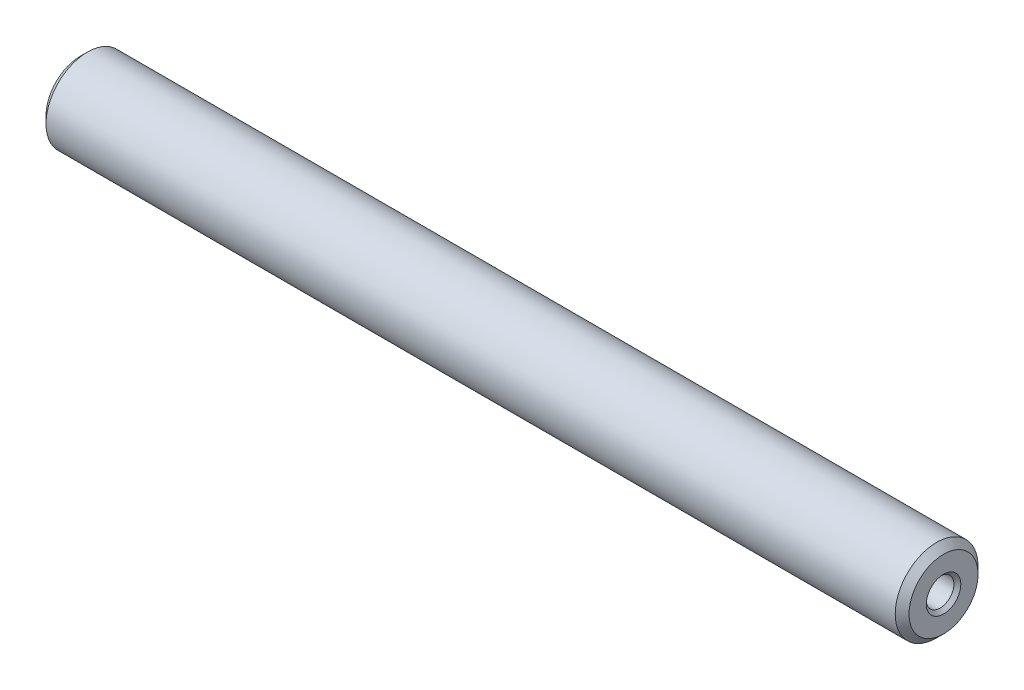
ISO-10303-21;
HEADER;
FILE_DESCRIPTION(('STEP AP214'),'2;1');
FILE_NAME('part.step','',(''),(''),'','','');
FILE_SCHEMA(('AUTOMOTIVE_DESIGN { 1 0 10303 214 1 1 1 1 }'));
ENDSEC;
DATA;
#1=APPLICATION_CONTEXT('core data for automotive mechanical design processes');
#2=APPLICATION_PROTOCOL_DEFINITION('international standard','automotive_design',2000,#1);
#3=PRODUCT_CONTEXT('',#1,'mechanical');
#4=PRODUCT('Part','Part','',(#3));
#5=PRODUCT_RELATED_PRODUCT_CATEGORY('part','',(#4));
#6=PRODUCT_DEFINITION_FORMATION('','',#4);
#7=PRODUCT_DEFINITION_CONTEXT('part definition',#1,'design');
#8=PRODUCT_DEFINITION('design','',#6,#7);
#9=PRODUCT_DEFINITION_SHAPE('','',#8);
#10=(LENGTH_UNIT() NAMED_UNIT(*) SI_UNIT(.MILLI.,.METRE.));
#11=(NAMED_UNIT(*) PLANE_ANGLE_UNIT() SI_UNIT($,.RADIAN.));
#12=(NAMED_UNIT(*) SI_UNIT($,.STERADIAN.) SOLID_ANGLE_UNIT());
#13=UNCERTAINTY_MEASURE_WITH_UNIT(LENGTH_MEASURE(1.E-05),#10,'distance_accuracy_value','');
#14=(GEOMETRIC_REPRESENTATION_CONTEXT(3) GLOBAL_UNCERTAINTY_ASSIGNED_CONTEXT((#13)) GLOBAL_UNIT_ASSIGNED_CONTEXT((#10,
#11,#12)) REPRESENTATION_CONTEXT('',''));
#15=CARTESIAN_POINT('',(0.,0.,0.));
#16=DIRECTION('',(0.,0.,1.));
#17=DIRECTION('',(1.,0.,0.));
#18=AXIS2_PLACEMENT_3D('',#15,#16,#17);
#19=CARTESIAN_POINT('',(-62.5,0.,0.));
#20=DIRECTION('',(1.,0.,0.));
#21=DIRECTION('',(0.,0.,-1.));
#22=AXIS2_PLACEMENT_3D('',#19,#20,#21);
#23=PLANE('',#22);
#24=CARTESIAN_POINT('',(-62.5,0.,0.));
#25=DIRECTION('',(-1.,0.,0.));
#26=DIRECTION('',(0.,0.,1.));
#27=AXIS2_PLACEMENT_3D('',#24,#25,#26);
#28=CIRCLE('',#27,2.5);
#29=CARTESIAN_POINT('',(-62.5,0.,2.5));
#30=VERTEX_POINT('',#29);
#31=EDGE_CURVE('E53',#30,#30,#28,.T.);
#32=ORIENTED_EDGE('',*,*,#31,.F.);
#33=EDGE_LOOP('',(#32));
#34=FACE_BOUND('',#33,.T.);
#35=CARTESIAN_POINT('',(-62.5,0.,0.));
#36=DIRECTION('',(1.,0.,0.));
#37=DIRECTION('',(0.,0.,-1.));
#38=AXIS2_PLACEMENT_3D('',#35,#36,#37);
#39=CIRCLE('',#38,4.99999999999999);
#40=CARTESIAN_POINT('',(-62.5,0.,-4.99999999999999));
#41=VERTEX_POINT('',#40);
#42=EDGE_CURVE('E11',#41,#41,#39,.F.);
#43=ORIENTED_EDGE('',*,*,#42,.T.);
#44=EDGE_LOOP('',(#43));
#45=FACE_BOUND('',#44,.T.);
#46=ADVANCED_FACE('F30',(#34,#45),#23,.F.);
#47=CARTESIAN_POINT('',(-35.6829716193656,0.,0.));
#48=DIRECTION('',(-1.,0.,0.));
#49=DIRECTION('',(0.,0.,1.));
#50=AXIS2_PLACEMENT_3D('',#47,#48,#49);
#51=CYLINDRICAL_SURFACE('',#50,6.);
#52=CARTESIAN_POINT('',(61.5,0.,0.));
#53=DIRECTION('',(-1.,0.,0.));
#54=DIRECTION('',(0.,0.,1.));
#55=AXIS2_PLACEMENT_3D('',#52,#53,#54);
#56=CIRCLE('',#55,6.);
#57=CARTESIAN_POINT('',(61.5,0.,6.));
#58=VERTEX_POINT('',#57);
#59=EDGE_CURVE('E72',#58,#58,#56,.T.);
#60=ORIENTED_EDGE('',*,*,#59,.T.);
#61=EDGE_LOOP('',(#60));
#62=FACE_BOUND('',#61,.T.);
#63=CARTESIAN_POINT('',(-61.5,0.,0.));
#64=DIRECTION('',(1.,0.,0.));
#65=DIRECTION('',(0.,0.,-1.));
#66=AXIS2_PLACEMENT_3D('',#63,#64,#65);
#67=CIRCLE('',#66,6.);
#68=CARTESIAN_POINT('',(-61.5,0.,-6.));
#69=VERTEX_POINT('',#68);
#70=EDGE_CURVE('E69',#69,#69,#67,.T.);
#71=ORIENTED_EDGE('',*,*,#70,.T.);
#72=EDGE_LOOP('',(#71));
#73=FACE_BOUND('',#72,.T.);
#74=ADVANCED_FACE('F86',(#62,#73),#51,.T.);
#75=CARTESIAN_POINT('',(62.5,6.,0.));
#76=DIRECTION('',(-1.,0.,0.));
#77=DIRECTION('',(0.,0.,1.));
#78=AXIS2_PLACEMENT_3D('',#75,#76,#77);
#79=PLANE('',#78);
#80=CARTESIAN_POINT('',(62.5,0.,0.));
#81=DIRECTION('',(1.,0.,0.));
#82=DIRECTION('',(0.,0.,-1.));
#83=AXIS2_PLACEMENT_3D('',#80,#81,#82);
#84=CIRCLE('',#83,2.5);
#85=CARTESIAN_POINT('',(62.5,0.,-2.5));
#86=VERTEX_POINT('',#85);
#87=EDGE_CURVE('E60',#86,#86,#84,.T.);
#88=ORIENTED_EDGE('',*,*,#87,.F.);
#89=EDGE_LOOP('',(#88));
#90=FACE_BOUND('',#89,.T.);
#91=CARTESIAN_POINT('',(62.5,0.,0.));
#92=DIRECTION('',(-1.,0.,0.));
#93=DIRECTION('',(0.,0.,1.));
#94=AXIS2_PLACEMENT_3D('',#91,#92,#93);
#95=CIRCLE('',#94,5.00000000000003);
#96=CARTESIAN_POINT('',(62.5,0.,5.00000000000003));
#97=VERTEX_POINT('',#96);
#98=EDGE_CURVE('E37',#97,#97,#95,.F.);
#99=ORIENTED_EDGE('',*,*,#98,.T.);
#100=EDGE_LOOP('',(#99));
#101=FACE_BOUND('',#100,.T.);
#102=ADVANCED_FACE('F77',(#90,#101),#79,.F.);
#103=CARTESIAN_POINT('',(61.5,0.,0.));
#104=DIRECTION('',(-1.,0.,0.));
#105=DIRECTION('',(0.,0.,1.));
#106=AXIS2_PLACEMENT_3D('',#103,#104,#105);
#107=CONICAL_SURFACE('',#106,6.,0.785398163397453);
#108=ORIENTED_EDGE('',*,*,#98,.F.);
#109=EDGE_LOOP('',(#108));
#110=FACE_BOUND('',#109,.T.);
#111=ORIENTED_EDGE('',*,*,#59,.F.);
#112=EDGE_LOOP('',(#111));
#113=FACE_BOUND('',#112,.T.);
#114=ADVANCED_FACE('F79',(#110,#113),#107,.T.);
#115=CARTESIAN_POINT('',(-62.5,0.,0.));
#116=DIRECTION('',(1.,0.,0.));
#117=DIRECTION('',(0.,0.,-1.));
#118=AXIS2_PLACEMENT_3D('',#115,#116,#117);
#119=CONICAL_SURFACE('',#118,4.99999999999999,0.785398163397453);
#120=ORIENTED_EDGE('',*,*,#70,.F.);
#121=EDGE_LOOP('',(#120));
#122=FACE_BOUND('',#121,.T.);
#123=ORIENTED_EDGE('',*,*,#42,.F.);
#124=EDGE_LOOP('',(#123));
#125=FACE_BOUND('',#124,.T.);
#126=ADVANCED_FACE('F82',(#122,#125),#119,.T.);
#127=CARTESIAN_POINT('',(-51.5,0.,0.));
#128=DIRECTION('',(-1.,0.,0.));
#129=DIRECTION('',(0.,0.,1.));
#130=AXIS2_PLACEMENT_3D('',#127,#128,#129);
#131=CONICAL_SURFACE('',#130,1.99999999999999,1.02974425867665);
#132=CARTESIAN_POINT('',(-50.2982787619449,0.,0.));
#133=VERTEX_POINT('',#132);
#134=VERTEX_LOOP('',#133);
#135=FACE_BOUND('',#134,.T.);
#136=CARTESIAN_POINT('',(-51.5,0.,0.));
#137=DIRECTION('',(-1.,0.,0.));
#138=DIRECTION('',(0.,0.,1.));
#139=AXIS2_PLACEMENT_3D('',#136,#137,#138);
#140=CIRCLE('',#139,1.99999999999999);
#141=CARTESIAN_POINT('',(-51.5,0.,1.99999999999999));
#142=VERTEX_POINT('',#141);
#143=EDGE_CURVE('E66',#142,#142,#140,.T.);
#144=ORIENTED_EDGE('',*,*,#143,.T.);
#145=EDGE_LOOP('',(#144));
#146=FACE_BOUND('',#145,.T.);
#147=ADVANCED_FACE('F93',(#135,#146),#131,.F.);
#148=CARTESIAN_POINT('',(-62.5,0.,0.));
#149=DIRECTION('',(-1.,0.,0.));
#150=DIRECTION('',(0.,0.,1.));
#151=AXIS2_PLACEMENT_3D('',#148,#149,#150);
#152=CYLINDRICAL_SURFACE('',#151,1.99999999999999);
#153=ORIENTED_EDGE('',*,*,#143,.F.);
#154=EDGE_LOOP('',(#153));
#155=FACE_BOUND('',#154,.T.);
#156=CARTESIAN_POINT('',(-62.,0.,0.));
#157=DIRECTION('',(-1.,0.,0.));
#158=DIRECTION('',(0.,0.,1.));
#159=AXIS2_PLACEMENT_3D('',#156,#157,#158);
#160=CIRCLE('',#159,2.);
#161=CARTESIAN_POINT('',(-62.,0.,2.));
#162=VERTEX_POINT('',#161);
#163=EDGE_CURVE('E57',#162,#162,#160,.T.);
#164=ORIENTED_EDGE('',*,*,#163,.T.);
#165=EDGE_LOOP('',(#164));
#166=FACE_BOUND('',#165,.T.);
#167=ADVANCED_FACE('F104',(#155,#166),#152,.F.);
#168=CARTESIAN_POINT('',(-62.5,0.,0.));
#169=DIRECTION('',(-1.,0.,0.));
#170=DIRECTION('',(0.,0.,1.));
#171=AXIS2_PLACEMENT_3D('',#168,#169,#170);
#172=CONICAL_SURFACE('',#171,2.5,0.785398163397449);
#173=ORIENTED_EDGE('',*,*,#163,.F.);
#174=EDGE_LOOP('',(#173));
#175=FACE_BOUND('',#174,.T.);
#176=ORIENTED_EDGE('',*,*,#31,.T.);
#177=EDGE_LOOP('',(#176));
#178=FACE_BOUND('',#177,.T.);
#179=ADVANCED_FACE('F47',(#175,#178),#172,.F.);
#180=CARTESIAN_POINT('',(51.5,0.,0.));
#181=DIRECTION('',(1.,0.,0.));
#182=DIRECTION('',(0.,0.,-1.));
#183=AXIS2_PLACEMENT_3D('',#180,#181,#182);
#184=CONICAL_SURFACE('',#183,1.99999999999999,1.02974425867665);
#185=CARTESIAN_POINT('',(50.2982787619449,0.,0.));
#186=VERTEX_POINT('',#185);
#187=VERTEX_LOOP('',#186);
#188=FACE_BOUND('',#187,.T.);
#189=CARTESIAN_POINT('',(51.5,0.,0.));
#190=DIRECTION('',(1.,0.,0.));
#191=DIRECTION('',(0.,0.,-1.));
#192=AXIS2_PLACEMENT_3D('',#189,#190,#191);
#193=CIRCLE('',#192,1.99999999999999);
#194=CARTESIAN_POINT('',(51.5,0.,-1.99999999999999));
#195=VERTEX_POINT('',#194);
#196=EDGE_CURVE('E51',#195,#195,#193,.T.);
#197=ORIENTED_EDGE('',*,*,#196,.T.);
#198=EDGE_LOOP('',(#197));
#199=FACE_BOUND('',#198,.T.);
#200=ADVANCED_FACE('F43',(#188,#199),#184,.F.);
#201=CARTESIAN_POINT('',(62.5,0.,0.));
#202=DIRECTION('',(1.,0.,0.));
#203=DIRECTION('',(0.,0.,-1.));
#204=AXIS2_PLACEMENT_3D('',#201,#202,#203);
#205=CYLINDRICAL_SURFACE('',#204,1.99999999999999);
#206=ORIENTED_EDGE('',*,*,#196,.F.);
#207=EDGE_LOOP('',(#206));
#208=FACE_BOUND('',#207,.T.);
#209=CARTESIAN_POINT('',(62.,0.,0.));
#210=DIRECTION('',(1.,0.,0.));
#211=DIRECTION('',(0.,0.,-1.));
#212=AXIS2_PLACEMENT_3D('',#209,#210,#211);
#213=CIRCLE('',#212,2.);
#214=CARTESIAN_POINT('',(62.,0.,-2.));
#215=VERTEX_POINT('',#214);
#216=EDGE_CURVE('E54',#215,#215,#213,.T.);
#217=ORIENTED_EDGE('',*,*,#216,.T.);
#218=EDGE_LOOP('',(#217));
#219=FACE_BOUND('',#218,.T.);
#220=ADVANCED_FACE('F46',(#208,#219),#205,.F.);
#221=CARTESIAN_POINT('',(62.5,0.,0.));
#222=DIRECTION('',(1.,0.,0.));
#223=DIRECTION('',(0.,0.,-1.));
#224=AXIS2_PLACEMENT_3D('',#221,#222,#223);
#225=CONICAL_SURFACE('',#224,2.5,0.785398163397449);
#226=ORIENTED_EDGE('',*,*,#216,.F.);
#227=EDGE_LOOP('',(#226));
#228=FACE_BOUND('',#227,.T.);
#229=ORIENTED_EDGE('',*,*,#87,.T.);
#230=EDGE_LOOP('',(#229));
#231=FACE_BOUND('',#230,.T.);
#232=ADVANCED_FACE('F124',(#228,#231),#225,.F.);
#233=CLOSED_SHELL('',(#46,#74,#102,#114,#126,#147,#167,#179,#200,#220,#232));
#234=MANIFOLD_SOLID_BREP('B2',#233);
#235=ADVANCED_BREP_SHAPE_REPRESENTATION('',(#18,#234),#14);
#236=SHAPE_DEFINITION_REPRESENTATION(#9,#235);
ENDSEC;
END-ISO-10303-21;
